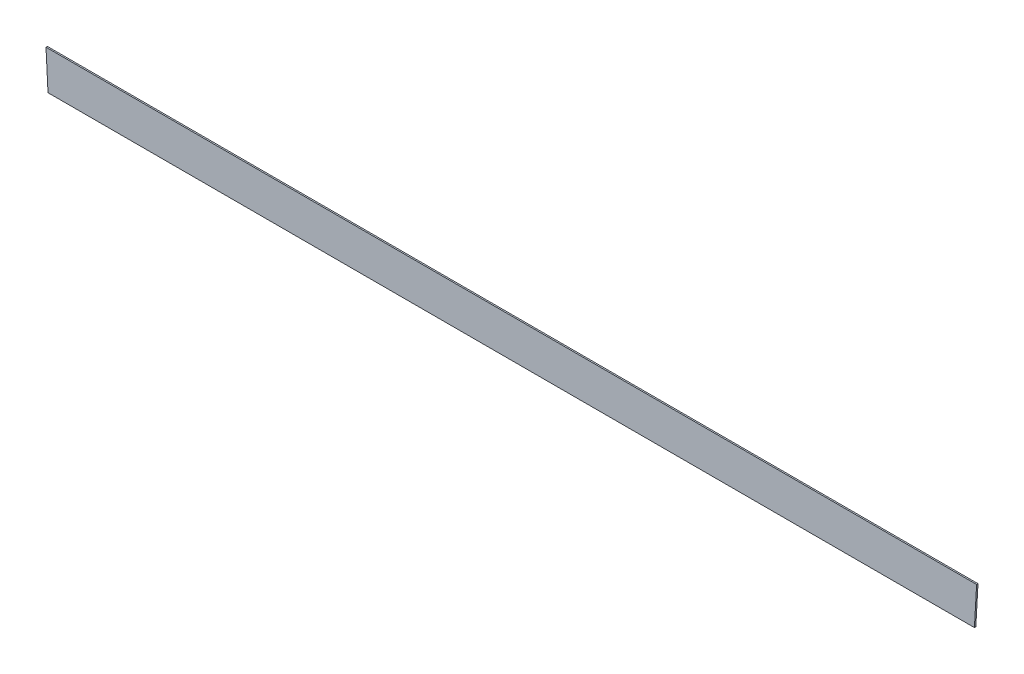
ISO-10303-21;
HEADER;
FILE_DESCRIPTION(('STEP AP214'),'2;1');
FILE_NAME('part.step','',(''),(''),'','','');
FILE_SCHEMA(('AUTOMOTIVE_DESIGN { 1 0 10303 214 1 1 1 1 }'));
ENDSEC;
DATA;
#1=APPLICATION_CONTEXT('core data for automotive mechanical design processes');
#2=APPLICATION_PROTOCOL_DEFINITION('international standard','automotive_design',2000,#1);
#3=PRODUCT_CONTEXT('',#1,'mechanical');
#4=PRODUCT('Part','Part','',(#3));
#5=PRODUCT_RELATED_PRODUCT_CATEGORY('part','',(#4));
#6=PRODUCT_DEFINITION_FORMATION('','',#4);
#7=PRODUCT_DEFINITION_CONTEXT('part definition',#1,'design');
#8=PRODUCT_DEFINITION('design','',#6,#7);
#9=PRODUCT_DEFINITION_SHAPE('','',#8);
#10=(LENGTH_UNIT() NAMED_UNIT(*) SI_UNIT(.MILLI.,.METRE.));
#11=(NAMED_UNIT(*) PLANE_ANGLE_UNIT() SI_UNIT($,.RADIAN.));
#12=(NAMED_UNIT(*) SI_UNIT($,.STERADIAN.) SOLID_ANGLE_UNIT());
#13=UNCERTAINTY_MEASURE_WITH_UNIT(LENGTH_MEASURE(1.E-05),#10,'distance_accuracy_value','');
#14=(GEOMETRIC_REPRESENTATION_CONTEXT(3) GLOBAL_UNCERTAINTY_ASSIGNED_CONTEXT((#13)) GLOBAL_UNIT_ASSIGNED_CONTEXT((#10,
#11,#12)) REPRESENTATION_CONTEXT('',''));
#15=CARTESIAN_POINT('',(0.,0.,0.));
#16=DIRECTION('',(0.,0.,1.));
#17=DIRECTION('',(1.,0.,0.));
#18=AXIS2_PLACEMENT_3D('',#15,#16,#17);
#19=CARTESIAN_POINT('',(-662.5,27.5,2.));
#20=DIRECTION('',(0.,-1.,0.));
#21=DIRECTION('',(0.,0.,-1.));
#22=AXIS2_PLACEMENT_3D('',#19,#20,#21);
#23=PLANE('',#22);
#24=DIRECTION('',(-1.,0.,0.));
#25=VECTOR('',#24,1.);
#26=CARTESIAN_POINT('',(-662.5,27.5,0.));
#27=LINE('',#26,#25);
#28=CARTESIAN_POINT('',(665.617572139433,27.5,0.));
#29=VERTEX_POINT('',#28);
#30=CARTESIAN_POINT('',(-665.382427860567,27.5,0.));
#31=VERTEX_POINT('',#30);
#32=EDGE_CURVE('E72',#29,#31,#27,.T.);
#33=ORIENTED_EDGE('',*,*,#32,.T.);
#34=DIRECTION('',(0.,0.,-1.));
#35=VECTOR('',#34,1.);
#36=CARTESIAN_POINT('',(-665.382427860567,27.5,2.));
#37=LINE('',#36,#35);
#38=CARTESIAN_POINT('',(-665.382427860567,27.5,2.));
#39=VERTEX_POINT('',#38);
#40=EDGE_CURVE('E11',#39,#31,#37,.T.);
#41=ORIENTED_EDGE('',*,*,#40,.F.);
#42=DIRECTION('',(-1.,0.,0.));
#43=VECTOR('',#42,1.);
#44=CARTESIAN_POINT('',(662.5,27.5,2.));
#45=LINE('',#44,#43);
#46=CARTESIAN_POINT('',(665.617572139433,27.5,2.));
#47=VERTEX_POINT('',#46);
#48=EDGE_CURVE('E77',#47,#39,#45,.T.);
#49=ORIENTED_EDGE('',*,*,#48,.F.);
#50=DIRECTION('',(0.,0.,-1.));
#51=VECTOR('',#50,1.);
#52=CARTESIAN_POINT('',(665.617572139433,27.5,2.));
#53=LINE('',#52,#51);
#54=EDGE_CURVE('E92',#47,#29,#53,.T.);
#55=ORIENTED_EDGE('',*,*,#54,.T.);
#56=EDGE_LOOP('',(#33,#41,#49,#55));
#57=FACE_BOUND('',#56,.T.);
#58=ADVANCED_FACE('F32',(#57),#23,.F.);
#59=CARTESIAN_POINT('',(-665.382427860567,27.5,2.));
#60=DIRECTION('',(0.998629534754574,0.0523359562429395,0.));
#61=DIRECTION('',(-0.0523359562429395,0.998629534754574,0.));
#62=AXIS2_PLACEMENT_3D('',#59,#60,#61);
#63=PLANE('',#62);
#64=DIRECTION('',(0.0523359562429395,-0.998629534754574,0.));
#65=VECTOR('',#64,1.);
#66=CARTESIAN_POINT('',(-665.382427860567,27.5,0.));
#67=LINE('',#66,#65);
#68=CARTESIAN_POINT('',(-662.5,-27.5,0.));
#69=VERTEX_POINT('',#68);
#70=EDGE_CURVE('E88',#31,#69,#67,.T.);
#71=ORIENTED_EDGE('',*,*,#70,.T.);
#72=DIRECTION('',(0.,0.,-1.));
#73=VECTOR('',#72,1.);
#74=CARTESIAN_POINT('',(-662.5,-27.5,2.));
#75=LINE('',#74,#73);
#76=CARTESIAN_POINT('',(-662.5,-27.5,2.));
#77=VERTEX_POINT('',#76);
#78=EDGE_CURVE('E40',#77,#69,#75,.T.);
#79=ORIENTED_EDGE('',*,*,#78,.F.);
#80=DIRECTION('',(0.0523359562429395,-0.998629534754574,0.));
#81=VECTOR('',#80,1.);
#82=CARTESIAN_POINT('',(-665.382427860567,27.5,2.));
#83=LINE('',#82,#81);
#84=EDGE_CURVE('E80',#39,#77,#83,.T.);
#85=ORIENTED_EDGE('',*,*,#84,.F.);
#86=ORIENTED_EDGE('',*,*,#40,.T.);
#87=EDGE_LOOP('',(#71,#79,#85,#86));
#88=FACE_BOUND('',#87,.T.);
#89=ADVANCED_FACE('F87',(#88),#63,.F.);
#90=CARTESIAN_POINT('',(-662.5,-27.5,2.));
#91=DIRECTION('',(0.,1.,0.));
#92=DIRECTION('',(0.,0.,1.));
#93=AXIS2_PLACEMENT_3D('',#90,#91,#92);
#94=PLANE('',#93);
#95=DIRECTION('',(1.,0.,0.));
#96=VECTOR('',#95,1.);
#97=CARTESIAN_POINT('',(-662.5,-27.5,0.));
#98=LINE('',#97,#96);
#99=CARTESIAN_POINT('',(662.5,-27.5,0.));
#100=VERTEX_POINT('',#99);
#101=EDGE_CURVE('E65',#69,#100,#98,.T.);
#102=ORIENTED_EDGE('',*,*,#101,.T.);
#103=DIRECTION('',(0.,0.,-1.));
#104=VECTOR('',#103,1.);
#105=CARTESIAN_POINT('',(662.5,-27.5,2.));
#106=LINE('',#105,#104);
#107=CARTESIAN_POINT('',(662.5,-27.5,2.));
#108=VERTEX_POINT('',#107);
#109=EDGE_CURVE('E89',#108,#100,#106,.T.);
#110=ORIENTED_EDGE('',*,*,#109,.F.);
#111=DIRECTION('',(1.,0.,0.));
#112=VECTOR('',#111,1.);
#113=CARTESIAN_POINT('',(-662.5,-27.5,2.));
#114=LINE('',#113,#112);
#115=EDGE_CURVE('E84',#77,#108,#114,.T.);
#116=ORIENTED_EDGE('',*,*,#115,.F.);
#117=ORIENTED_EDGE('',*,*,#78,.T.);
#118=EDGE_LOOP('',(#102,#110,#116,#117));
#119=FACE_BOUND('',#118,.T.);
#120=ADVANCED_FACE('F90',(#119),#94,.F.);
#121=CARTESIAN_POINT('',(665.617572139433,27.5,2.));
#122=DIRECTION('',(-0.998397372270005,0.0565922878522193,0.));
#123=DIRECTION('',(-0.0565922878522194,-0.998397372270005,0.));
#124=AXIS2_PLACEMENT_3D('',#121,#122,#123);
#125=PLANE('',#124);
#126=DIRECTION('',(0.0565922878522193,0.998397372270005,0.));
#127=VECTOR('',#126,1.);
#128=CARTESIAN_POINT('',(665.617572139433,27.5,0.));
#129=LINE('',#128,#127);
#130=EDGE_CURVE('E99',#100,#29,#129,.T.);
#131=ORIENTED_EDGE('',*,*,#130,.T.);
#132=ORIENTED_EDGE('',*,*,#54,.F.);
#133=DIRECTION('',(0.0565922878522193,0.998397372270005,0.));
#134=VECTOR('',#133,1.);
#135=CARTESIAN_POINT('',(665.617572139433,27.5,2.));
#136=LINE('',#135,#134);
#137=EDGE_CURVE('E48',#108,#47,#136,.T.);
#138=ORIENTED_EDGE('',*,*,#137,.F.);
#139=ORIENTED_EDGE('',*,*,#109,.T.);
#140=EDGE_LOOP('',(#131,#132,#138,#139));
#141=FACE_BOUND('',#140,.T.);
#142=ADVANCED_FACE('F104',(#141),#125,.F.);
#143=CARTESIAN_POINT('',(0.,0.,2.));
#144=DIRECTION('',(0.,0.,-1.));
#145=DIRECTION('',(-1.,0.,0.));
#146=AXIS2_PLACEMENT_3D('',#143,#144,#145);
#147=PLANE('',#146);
#148=ORIENTED_EDGE('',*,*,#48,.T.);
#149=ORIENTED_EDGE('',*,*,#84,.T.);
#150=ORIENTED_EDGE('',*,*,#115,.T.);
#151=ORIENTED_EDGE('',*,*,#137,.T.);
#152=EDGE_LOOP('',(#148,#149,#150,#151));
#153=FACE_BOUND('',#152,.T.);
#154=ADVANCED_FACE('F82',(#153),#147,.F.);
#155=CARTESIAN_POINT('',(0.,0.,0.));
#156=DIRECTION('',(0.,0.,-1.));
#157=DIRECTION('',(-1.,0.,0.));
#158=AXIS2_PLACEMENT_3D('',#155,#156,#157);
#159=PLANE('',#158);
#160=ORIENTED_EDGE('',*,*,#32,.F.);
#161=ORIENTED_EDGE('',*,*,#130,.F.);
#162=ORIENTED_EDGE('',*,*,#101,.F.);
#163=ORIENTED_EDGE('',*,*,#70,.F.);
#164=EDGE_LOOP('',(#160,#161,#162,#163));
#165=FACE_BOUND('',#164,.T.);
#166=ADVANCED_FACE('F105',(#165),#159,.T.);
#167=CLOSED_SHELL('',(#58,#89,#120,#142,#154,#166));
#168=MANIFOLD_SOLID_BREP('B2',#167);
#169=ADVANCED_BREP_SHAPE_REPRESENTATION('',(#18,#168),#14);
#170=SHAPE_DEFINITION_REPRESENTATION(#9,#169);
ENDSEC;
END-ISO-10303-21;
